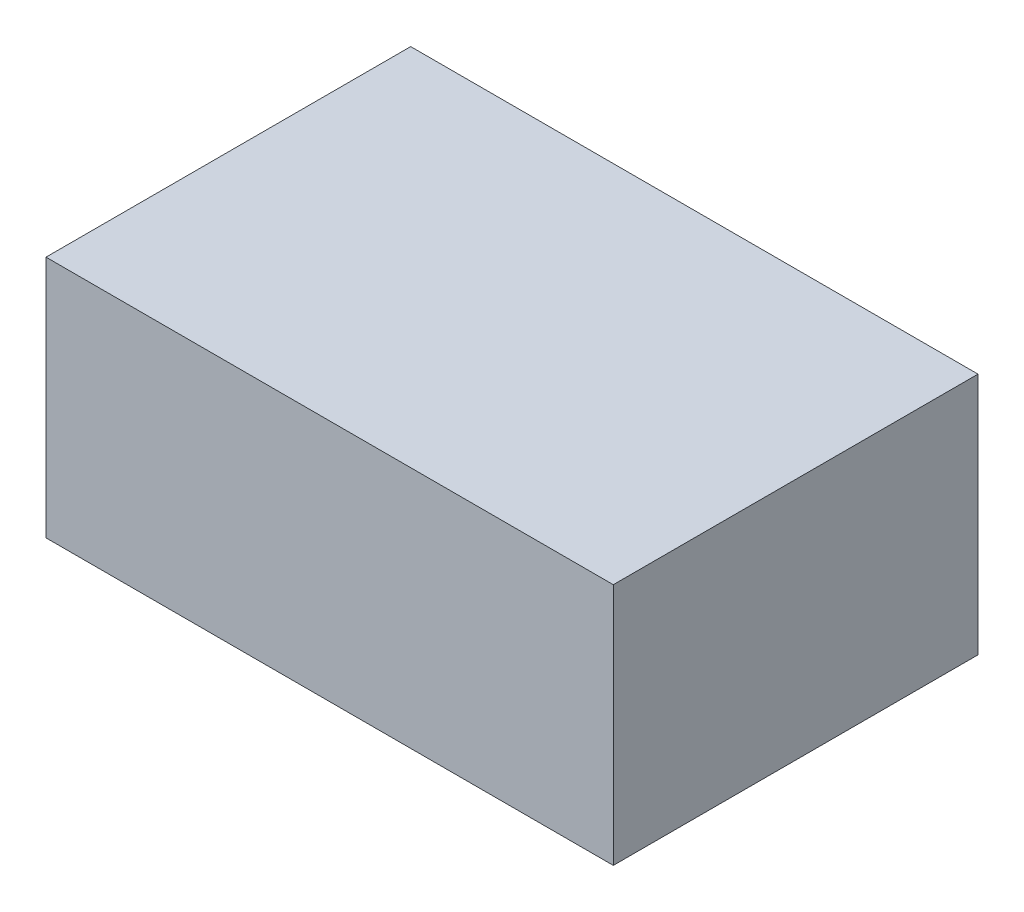
ISO-10303-21;
HEADER;
FILE_DESCRIPTION(('STEP AP214'),'2;1');
FILE_NAME('part.step','',(''),(''),'','','');
FILE_SCHEMA(('AUTOMOTIVE_DESIGN { 1 0 10303 214 1 1 1 1 }'));
ENDSEC;
DATA;
#1=APPLICATION_CONTEXT('core data for automotive mechanical design processes');
#2=APPLICATION_PROTOCOL_DEFINITION('international standard','automotive_design',2000,#1);
#3=PRODUCT_CONTEXT('',#1,'mechanical');
#4=PRODUCT('Part','Part','',(#3));
#5=PRODUCT_RELATED_PRODUCT_CATEGORY('part','',(#4));
#6=PRODUCT_DEFINITION_FORMATION('','',#4);
#7=PRODUCT_DEFINITION_CONTEXT('part definition',#1,'design');
#8=PRODUCT_DEFINITION('design','',#6,#7);
#9=PRODUCT_DEFINITION_SHAPE('','',#8);
#10=(LENGTH_UNIT() NAMED_UNIT(*) SI_UNIT(.MILLI.,.METRE.));
#11=(NAMED_UNIT(*) PLANE_ANGLE_UNIT() SI_UNIT($,.RADIAN.));
#12=(NAMED_UNIT(*) SI_UNIT($,.STERADIAN.) SOLID_ANGLE_UNIT());
#13=UNCERTAINTY_MEASURE_WITH_UNIT(LENGTH_MEASURE(1.E-05),#10,'distance_accuracy_value','');
#14=(GEOMETRIC_REPRESENTATION_CONTEXT(3) GLOBAL_UNCERTAINTY_ASSIGNED_CONTEXT((#13)) GLOBAL_UNIT_ASSIGNED_CONTEXT((#10,
#11,#12)) REPRESENTATION_CONTEXT('',''));
#15=CARTESIAN_POINT('',(0.,0.,0.));
#16=DIRECTION('',(0.,0.,1.));
#17=DIRECTION('',(1.,0.,0.));
#18=AXIS2_PLACEMENT_3D('',#15,#16,#17);
#19=CARTESIAN_POINT('',(0.,30.48,0.));
#20=DIRECTION('',(1.,0.,0.));
#21=DIRECTION('',(0.,0.,-1.));
#22=AXIS2_PLACEMENT_3D('',#19,#20,#21);
#23=PLANE('',#22);
#24=DIRECTION('',(0.,0.,1.));
#25=VECTOR('',#24,1.);
#26=CARTESIAN_POINT('',(0.,0.,0.));
#27=LINE('',#26,#25);
#28=CARTESIAN_POINT('',(0.,0.,-45.72));
#29=VERTEX_POINT('',#28);
#30=CARTESIAN_POINT('',(0.,0.,0.));
#31=VERTEX_POINT('',#30);
#32=EDGE_CURVE('E96',#29,#31,#27,.T.);
#33=ORIENTED_EDGE('',*,*,#32,.T.);
#34=DIRECTION('',(0.,-1.,0.));
#35=VECTOR('',#34,1.);
#36=CARTESIAN_POINT('',(0.,30.48,0.));
#37=LINE('',#36,#35);
#38=CARTESIAN_POINT('',(0.,30.48,0.));
#39=VERTEX_POINT('',#38);
#40=EDGE_CURVE('E11',#39,#31,#37,.T.);
#41=ORIENTED_EDGE('',*,*,#40,.F.);
#42=DIRECTION('',(0.,0.,1.));
#43=VECTOR('',#42,1.);
#44=CARTESIAN_POINT('',(0.,30.48,0.));
#45=LINE('',#44,#43);
#46=CARTESIAN_POINT('',(0.,30.48,-45.72));
#47=VERTEX_POINT('',#46);
#48=EDGE_CURVE('E84',#47,#39,#45,.T.);
#49=ORIENTED_EDGE('',*,*,#48,.F.);
#50=DIRECTION('',(0.,-1.,0.));
#51=VECTOR('',#50,1.);
#52=CARTESIAN_POINT('',(0.,30.48,-45.72));
#53=LINE('',#52,#51);
#54=EDGE_CURVE('E92',#47,#29,#53,.T.);
#55=ORIENTED_EDGE('',*,*,#54,.T.);
#56=EDGE_LOOP('',(#33,#41,#49,#55));
#57=FACE_BOUND('',#56,.T.);
#58=ADVANCED_FACE('F33',(#57),#23,.F.);
#59=CARTESIAN_POINT('',(0.,30.48,0.));
#60=DIRECTION('',(0.,0.,-1.));
#61=DIRECTION('',(-1.,0.,0.));
#62=AXIS2_PLACEMENT_3D('',#59,#60,#61);
#63=PLANE('',#62);
#64=DIRECTION('',(1.,0.,0.));
#65=VECTOR('',#64,1.);
#66=CARTESIAN_POINT('',(0.,0.,0.));
#67=LINE('',#66,#65);
#68=CARTESIAN_POINT('',(71.12,0.,0.));
#69=VERTEX_POINT('',#68);
#70=EDGE_CURVE('E88',#31,#69,#67,.T.);
#71=ORIENTED_EDGE('',*,*,#70,.T.);
#72=DIRECTION('',(0.,-1.,0.));
#73=VECTOR('',#72,1.);
#74=CARTESIAN_POINT('',(71.12,30.48,0.));
#75=LINE('',#74,#73);
#76=CARTESIAN_POINT('',(71.12,30.48,0.));
#77=VERTEX_POINT('',#76);
#78=EDGE_CURVE('E41',#77,#69,#75,.T.);
#79=ORIENTED_EDGE('',*,*,#78,.F.);
#80=DIRECTION('',(1.,0.,0.));
#81=VECTOR('',#80,1.);
#82=CARTESIAN_POINT('',(0.,30.48,0.));
#83=LINE('',#82,#81);
#84=EDGE_CURVE('E79',#39,#77,#83,.T.);
#85=ORIENTED_EDGE('',*,*,#84,.F.);
#86=ORIENTED_EDGE('',*,*,#40,.T.);
#87=EDGE_LOOP('',(#71,#79,#85,#86));
#88=FACE_BOUND('',#87,.T.);
#89=ADVANCED_FACE('F87',(#88),#63,.F.);
#90=CARTESIAN_POINT('',(71.12,30.48,0.));
#91=DIRECTION('',(-1.,0.,0.));
#92=DIRECTION('',(0.,0.,1.));
#93=AXIS2_PLACEMENT_3D('',#90,#91,#92);
#94=PLANE('',#93);
#95=DIRECTION('',(0.,0.,-1.));
#96=VECTOR('',#95,1.);
#97=CARTESIAN_POINT('',(71.12,0.,0.));
#98=LINE('',#97,#96);
#99=CARTESIAN_POINT('',(71.12,0.,-45.72));
#100=VERTEX_POINT('',#99);
#101=EDGE_CURVE('E66',#69,#100,#98,.T.);
#102=ORIENTED_EDGE('',*,*,#101,.T.);
#103=DIRECTION('',(0.,-1.,0.));
#104=VECTOR('',#103,1.);
#105=CARTESIAN_POINT('',(71.12,30.48,-45.72));
#106=LINE('',#105,#104);
#107=CARTESIAN_POINT('',(71.12,30.48,-45.72));
#108=VERTEX_POINT('',#107);
#109=EDGE_CURVE('E89',#108,#100,#106,.T.);
#110=ORIENTED_EDGE('',*,*,#109,.F.);
#111=DIRECTION('',(0.,0.,-1.));
#112=VECTOR('',#111,1.);
#113=CARTESIAN_POINT('',(71.12,30.48,0.));
#114=LINE('',#113,#112);
#115=EDGE_CURVE('E82',#77,#108,#114,.T.);
#116=ORIENTED_EDGE('',*,*,#115,.F.);
#117=ORIENTED_EDGE('',*,*,#78,.T.);
#118=EDGE_LOOP('',(#102,#110,#116,#117));
#119=FACE_BOUND('',#118,.T.);
#120=ADVANCED_FACE('F90',(#119),#94,.F.);
#121=CARTESIAN_POINT('',(0.,30.48,-45.72));
#122=DIRECTION('',(0.,0.,1.));
#123=DIRECTION('',(1.,0.,0.));
#124=AXIS2_PLACEMENT_3D('',#121,#122,#123);
#125=PLANE('',#124);
#126=DIRECTION('',(-1.,0.,0.));
#127=VECTOR('',#126,1.);
#128=CARTESIAN_POINT('',(0.,0.,-45.72));
#129=LINE('',#128,#127);
#130=EDGE_CURVE('E72',#100,#29,#129,.T.);
#131=ORIENTED_EDGE('',*,*,#130,.T.);
#132=ORIENTED_EDGE('',*,*,#54,.F.);
#133=DIRECTION('',(-1.,0.,0.));
#134=VECTOR('',#133,1.);
#135=CARTESIAN_POINT('',(0.,30.48,-45.72));
#136=LINE('',#135,#134);
#137=EDGE_CURVE('E49',#108,#47,#136,.T.);
#138=ORIENTED_EDGE('',*,*,#137,.F.);
#139=ORIENTED_EDGE('',*,*,#109,.T.);
#140=EDGE_LOOP('',(#131,#132,#138,#139));
#141=FACE_BOUND('',#140,.T.);
#142=ADVANCED_FACE('F103',(#141),#125,.F.);
#143=CARTESIAN_POINT('',(0.,30.48,0.));
#144=DIRECTION('',(0.,-1.,0.));
#145=DIRECTION('',(0.,0.,-1.));
#146=AXIS2_PLACEMENT_3D('',#143,#144,#145);
#147=PLANE('',#146);
#148=ORIENTED_EDGE('',*,*,#48,.T.);
#149=ORIENTED_EDGE('',*,*,#84,.T.);
#150=ORIENTED_EDGE('',*,*,#115,.T.);
#151=ORIENTED_EDGE('',*,*,#137,.T.);
#152=EDGE_LOOP('',(#148,#149,#150,#151));
#153=FACE_BOUND('',#152,.T.);
#154=ADVANCED_FACE('F80',(#153),#147,.F.);
#155=CARTESIAN_POINT('',(0.,0.,0.));
#156=DIRECTION('',(0.,-1.,0.));
#157=DIRECTION('',(0.,0.,-1.));
#158=AXIS2_PLACEMENT_3D('',#155,#156,#157);
#159=PLANE('',#158);
#160=ORIENTED_EDGE('',*,*,#32,.F.);
#161=ORIENTED_EDGE('',*,*,#130,.F.);
#162=ORIENTED_EDGE('',*,*,#101,.F.);
#163=ORIENTED_EDGE('',*,*,#70,.F.);
#164=EDGE_LOOP('',(#160,#161,#162,#163));
#165=FACE_BOUND('',#164,.T.);
#166=ADVANCED_FACE('F106',(#165),#159,.T.);
#167=CLOSED_SHELL('',(#58,#89,#120,#142,#154,#166));
#168=MANIFOLD_SOLID_BREP('B2',#167);
#169=ADVANCED_BREP_SHAPE_REPRESENTATION('',(#18,#168),#14);
#170=SHAPE_DEFINITION_REPRESENTATION(#9,#169);
ENDSEC;
END-ISO-10303-21;
